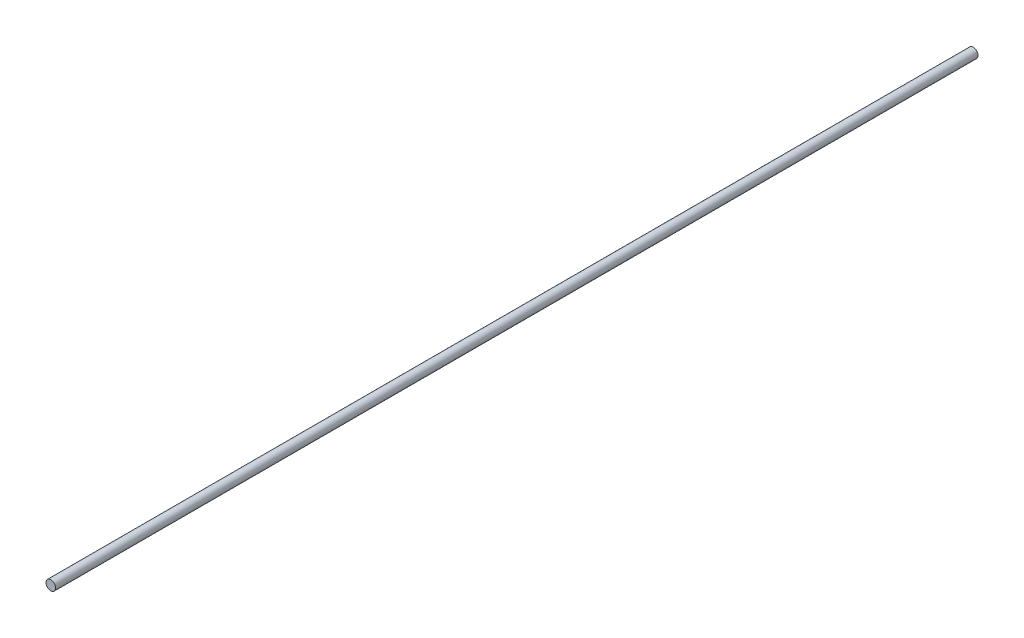
ISO-10303-21;
HEADER;
FILE_DESCRIPTION(('STEP AP214'),'2;1');
FILE_NAME('part.step','',(''),(''),'','','');
FILE_SCHEMA(('AUTOMOTIVE_DESIGN { 1 0 10303 214 1 1 1 1 }'));
ENDSEC;
DATA;
#1=APPLICATION_CONTEXT('core data for automotive mechanical design processes');
#2=APPLICATION_PROTOCOL_DEFINITION('international standard','automotive_design',2000,#1);
#3=PRODUCT_CONTEXT('',#1,'mechanical');
#4=PRODUCT('Part','Part','',(#3));
#5=PRODUCT_RELATED_PRODUCT_CATEGORY('part','',(#4));
#6=PRODUCT_DEFINITION_FORMATION('','',#4);
#7=PRODUCT_DEFINITION_CONTEXT('part definition',#1,'design');
#8=PRODUCT_DEFINITION('design','',#6,#7);
#9=PRODUCT_DEFINITION_SHAPE('','',#8);
#10=(LENGTH_UNIT() NAMED_UNIT(*) SI_UNIT(.MILLI.,.METRE.));
#11=(NAMED_UNIT(*) PLANE_ANGLE_UNIT() SI_UNIT($,.RADIAN.));
#12=(NAMED_UNIT(*) SI_UNIT($,.STERADIAN.) SOLID_ANGLE_UNIT());
#13=UNCERTAINTY_MEASURE_WITH_UNIT(LENGTH_MEASURE(1.E-05),#10,'distance_accuracy_value','');
#14=(GEOMETRIC_REPRESENTATION_CONTEXT(3) GLOBAL_UNCERTAINTY_ASSIGNED_CONTEXT((#13)) GLOBAL_UNIT_ASSIGNED_CONTEXT((#10,
#11,#12)) REPRESENTATION_CONTEXT('',''));
#15=CARTESIAN_POINT('',(0.,0.,0.));
#16=DIRECTION('',(0.,0.,1.));
#17=DIRECTION('',(1.,0.,0.));
#18=AXIS2_PLACEMENT_3D('',#15,#16,#17);
#19=CARTESIAN_POINT('',(0.,0.,457.2));
#20=DIRECTION('',(0.,0.,-1.));
#21=DIRECTION('',(-1.,0.,0.));
#22=AXIS2_PLACEMENT_3D('',#19,#20,#21);
#23=CYLINDRICAL_SURFACE('',#22,4.7625);
#24=CARTESIAN_POINT('',(0.,0.,457.2));
#25=DIRECTION('',(0.,0.,1.));
#26=DIRECTION('',(1.,0.,0.));
#27=AXIS2_PLACEMENT_3D('',#24,#25,#26);
#28=CIRCLE('',#27,4.7625);
#29=CARTESIAN_POINT('',(4.7625,0.,457.2));
#30=VERTEX_POINT('',#29);
#31=EDGE_CURVE('E10',#30,#30,#28,.T.);
#32=ORIENTED_EDGE('',*,*,#31,.F.);
#33=EDGE_LOOP('',(#32));
#34=FACE_BOUND('',#33,.T.);
#35=CARTESIAN_POINT('',(0.,0.,-457.2));
#36=DIRECTION('',(0.,0.,1.));
#37=DIRECTION('',(1.,0.,0.));
#38=AXIS2_PLACEMENT_3D('',#35,#36,#37);
#39=CIRCLE('',#38,4.7625);
#40=CARTESIAN_POINT('',(4.7625,0.,-457.2));
#41=VERTEX_POINT('',#40);
#42=EDGE_CURVE('E44',#41,#41,#39,.T.);
#43=ORIENTED_EDGE('',*,*,#42,.T.);
#44=EDGE_LOOP('',(#43));
#45=FACE_BOUND('',#44,.T.);
#46=ADVANCED_FACE('F41',(#34,#45),#23,.T.);
#47=CARTESIAN_POINT('',(0.,0.,457.2));
#48=DIRECTION('',(0.,0.,1.));
#49=DIRECTION('',(1.,0.,0.));
#50=AXIS2_PLACEMENT_3D('',#47,#48,#49);
#51=PLANE('',#50);
#52=ORIENTED_EDGE('',*,*,#31,.T.);
#53=EDGE_LOOP('',(#52));
#54=FACE_BOUND('',#53,.T.);
#55=ADVANCED_FACE('F58',(#54),#51,.T.);
#56=CARTESIAN_POINT('',(0.,0.,-457.2));
#57=DIRECTION('',(0.,0.,1.));
#58=DIRECTION('',(1.,0.,0.));
#59=AXIS2_PLACEMENT_3D('',#56,#57,#58);
#60=PLANE('',#59);
#61=ORIENTED_EDGE('',*,*,#42,.F.);
#62=EDGE_LOOP('',(#61));
#63=FACE_BOUND('',#62,.T.);
#64=ADVANCED_FACE('F56',(#63),#60,.F.);
#65=CLOSED_SHELL('',(#46,#55,#64));
#66=MANIFOLD_SOLID_BREP('B2',#65);
#67=ADVANCED_BREP_SHAPE_REPRESENTATION('',(#18,#66),#14);
#68=SHAPE_DEFINITION_REPRESENTATION(#9,#67);
ENDSEC;
END-ISO-10303-21;
